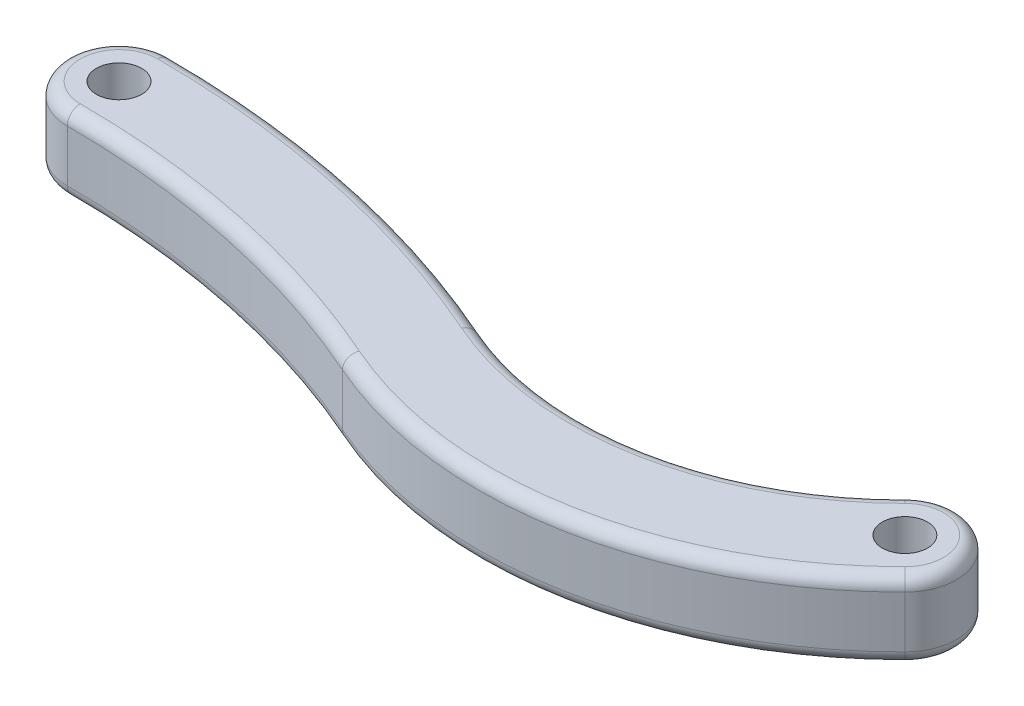
ISO-10303-21;
HEADER;
FILE_DESCRIPTION(('STEP AP214'),'2;1');
FILE_NAME('part.step','',(''),(''),'','','');
FILE_SCHEMA(('AUTOMOTIVE_DESIGN { 1 0 10303 214 1 1 1 1 }'));
ENDSEC;
DATA;
#1=APPLICATION_CONTEXT('core data for automotive mechanical design processes');
#2=APPLICATION_PROTOCOL_DEFINITION('international standard','automotive_design',2000,#1);
#3=PRODUCT_CONTEXT('',#1,'mechanical');
#4=PRODUCT('Part','Part','',(#3));
#5=PRODUCT_RELATED_PRODUCT_CATEGORY('part','',(#4));
#6=PRODUCT_DEFINITION_FORMATION('','',#4);
#7=PRODUCT_DEFINITION_CONTEXT('part definition',#1,'design');
#8=PRODUCT_DEFINITION('design','',#6,#7);
#9=PRODUCT_DEFINITION_SHAPE('','',#8);
#10=(LENGTH_UNIT() NAMED_UNIT(*) SI_UNIT(.MILLI.,.METRE.));
#11=(NAMED_UNIT(*) PLANE_ANGLE_UNIT() SI_UNIT($,.RADIAN.));
#12=(NAMED_UNIT(*) SI_UNIT($,.STERADIAN.) SOLID_ANGLE_UNIT());
#13=UNCERTAINTY_MEASURE_WITH_UNIT(LENGTH_MEASURE(1.E-05),#10,'distance_accuracy_value','');
#14=(GEOMETRIC_REPRESENTATION_CONTEXT(3) GLOBAL_UNCERTAINTY_ASSIGNED_CONTEXT((#13)) GLOBAL_UNIT_ASSIGNED_CONTEXT((#10,
#11,#12)) REPRESENTATION_CONTEXT('',''));
#15=CARTESIAN_POINT('',(0.,0.,0.));
#16=DIRECTION('',(0.,0.,1.));
#17=DIRECTION('',(1.,0.,0.));
#18=AXIS2_PLACEMENT_3D('',#15,#16,#17);
#19=CARTESIAN_POINT('',(-10.253048327205,6.,25.1576044043321));
#20=DIRECTION('',(0.,-1.,0.));
#21=DIRECTION('',(0.,0.,-1.));
#22=AXIS2_PLACEMENT_3D('',#19,#20,#21);
#23=PLANE('',#22);
#24=CARTESIAN_POINT('',(9.89390334559001,6.,-20.5060966544098));
#25=DIRECTION('',(0.,-1.,0.));
#26=DIRECTION('',(0.,0.,-1.));
#27=AXIS2_PLACEMENT_3D('',#24,#25,#26);
#28=CIRCLE('',#27,32.);
#29=CARTESIAN_POINT('',(-3.02322793292108,6.,8.77098857506128));
#30=VERTEX_POINT('',#29);
#31=CARTESIAN_POINT('',(32.5213203435597,6.,2.12132034355962));
#32=VERTEX_POINT('',#31);
#33=EDGE_CURVE('E154',#30,#32,#28,.F.);
#34=ORIENTED_EDGE('',*,*,#33,.T.);
#35=CARTESIAN_POINT('',(30.4,6.,0.));
#36=DIRECTION('',(0.,-1.,0.));
#37=DIRECTION('',(0.,0.,-1.));
#38=AXIS2_PLACEMENT_3D('',#35,#36,#37);
#39=CIRCLE('',#38,3.);
#40=CARTESIAN_POINT('',(28.2786796564403,6.,-2.12132034355963));
#41=VERTEX_POINT('',#40);
#42=EDGE_CURVE('E135',#32,#41,#39,.F.);
#43=ORIENTED_EDGE('',*,*,#42,.T.);
#44=CARTESIAN_POINT('',(9.89390334558999,6.,-20.5060966544098));
#45=DIRECTION('',(0.,-1.,0.));
#46=DIRECTION('',(0.,0.,-1.));
#47=AXIS2_PLACEMENT_3D('',#44,#45,#46);
#48=CIRCLE('',#47,26.);
#49=CARTESIAN_POINT('',(-0.601265818200273,6.,3.28153509453545));
#50=VERTEX_POINT('',#49);
#51=EDGE_CURVE('E143',#41,#50,#48,.T.);
#52=ORIENTED_EDGE('',*,*,#51,.T.);
#53=CARTESIAN_POINT('',(-30.4,6.,70.8213054630739));
#54=DIRECTION('',(0.,-1.,0.));
#55=DIRECTION('',(0.,0.,-1.));
#56=AXIS2_PLACEMENT_3D('',#53,#54,#55);
#57=CIRCLE('',#56,73.8213054630739);
#58=CARTESIAN_POINT('',(-30.4,6.,-3.));
#59=VERTEX_POINT('',#58);
#60=EDGE_CURVE('E149',#50,#59,#57,.F.);
#61=ORIENTED_EDGE('',*,*,#60,.T.);
#62=CARTESIAN_POINT('',(-30.4,6.,0.));
#63=DIRECTION('',(0.,-1.,0.));
#64=DIRECTION('',(0.,0.,-1.));
#65=AXIS2_PLACEMENT_3D('',#62,#63,#64);
#66=CIRCLE('',#65,3.);
#67=CARTESIAN_POINT('',(-30.4,6.,3.));
#68=VERTEX_POINT('',#67);
#69=EDGE_CURVE('E266',#59,#68,#66,.F.);
#70=ORIENTED_EDGE('',*,*,#69,.T.);
#71=CARTESIAN_POINT('',(-30.4,6.,70.8213054630739));
#72=DIRECTION('',(0.,-1.,0.));
#73=DIRECTION('',(0.,0.,-1.));
#74=AXIS2_PLACEMENT_3D('',#71,#72,#73);
#75=CIRCLE('',#74,67.8213054630739);
#76=EDGE_CURVE('E160',#68,#30,#75,.T.);
#77=ORIENTED_EDGE('',*,*,#76,.T.);
#78=EDGE_LOOP('',(#34,#43,#52,#61,#70,#77));
#79=FACE_BOUND('',#78,.T.);
#80=CARTESIAN_POINT('',(-30.4,6.,0.));
#81=DIRECTION('',(0.,1.,0.));
#82=DIRECTION('',(0.,0.,1.));
#83=AXIS2_PLACEMENT_3D('',#80,#81,#82);
#84=CIRCLE('',#83,1.75);
#85=CARTESIAN_POINT('',(-30.4,6.,1.75));
#86=VERTEX_POINT('',#85);
#87=EDGE_CURVE('E254',#86,#86,#84,.T.);
#88=ORIENTED_EDGE('',*,*,#87,.F.);
#89=EDGE_LOOP('',(#88));
#90=FACE_BOUND('',#89,.T.);
#91=CARTESIAN_POINT('',(30.4,6.,0.));
#92=DIRECTION('',(0.,1.,0.));
#93=DIRECTION('',(0.,0.,1.));
#94=AXIS2_PLACEMENT_3D('',#91,#92,#93);
#95=CIRCLE('',#94,1.75);
#96=CARTESIAN_POINT('',(30.4,6.,1.75));
#97=VERTEX_POINT('',#96);
#98=EDGE_CURVE('E472',#97,#97,#95,.T.);
#99=ORIENTED_EDGE('',*,*,#98,.F.);
#100=EDGE_LOOP('',(#99));
#101=FACE_BOUND('',#100,.T.);
#102=ADVANCED_FACE('F38',(#79,#90,#101),#23,.F.);
#103=CARTESIAN_POINT('',(-10.253048327205,0.,25.1576044043321));
#104=DIRECTION('',(0.,-1.,0.));
#105=DIRECTION('',(0.,0.,-1.));
#106=AXIS2_PLACEMENT_3D('',#103,#104,#105);
#107=PLANE('',#106);
#108=CARTESIAN_POINT('',(9.89390334558999,0.,-20.5060966544098));
#109=DIRECTION('',(0.,-1.,0.));
#110=DIRECTION('',(0.,0.,-1.));
#111=AXIS2_PLACEMENT_3D('',#108,#109,#110);
#112=CIRCLE('',#111,26.);
#113=CARTESIAN_POINT('',(-0.601265818200273,0.,3.28153509453545));
#114=VERTEX_POINT('',#113);
#115=CARTESIAN_POINT('',(28.2786796564403,0.,-2.12132034355963));
#116=VERTEX_POINT('',#115);
#117=EDGE_CURVE('E181',#114,#116,#112,.F.);
#118=ORIENTED_EDGE('',*,*,#117,.T.);
#119=CARTESIAN_POINT('',(30.4,0.,0.));
#120=DIRECTION('',(0.,-1.,0.));
#121=DIRECTION('',(0.,0.,-1.));
#122=AXIS2_PLACEMENT_3D('',#119,#120,#121);
#123=CIRCLE('',#122,3.);
#124=CARTESIAN_POINT('',(32.5213203435597,0.,2.12132034355962));
#125=VERTEX_POINT('',#124);
#126=EDGE_CURVE('E190',#116,#125,#123,.T.);
#127=ORIENTED_EDGE('',*,*,#126,.T.);
#128=CARTESIAN_POINT('',(9.89390334559001,0.,-20.5060966544098));
#129=DIRECTION('',(0.,-1.,0.));
#130=DIRECTION('',(0.,0.,-1.));
#131=AXIS2_PLACEMENT_3D('',#128,#129,#130);
#132=CIRCLE('',#131,32.);
#133=CARTESIAN_POINT('',(-3.02322793292108,0.,8.77098857506128));
#134=VERTEX_POINT('',#133);
#135=EDGE_CURVE('E62',#125,#134,#132,.T.);
#136=ORIENTED_EDGE('',*,*,#135,.T.);
#137=CARTESIAN_POINT('',(-30.4,0.,70.8213054630739));
#138=DIRECTION('',(0.,-1.,0.));
#139=DIRECTION('',(0.,0.,-1.));
#140=AXIS2_PLACEMENT_3D('',#137,#138,#139);
#141=CIRCLE('',#140,67.8213054630739);
#142=CARTESIAN_POINT('',(-30.4,0.,3.));
#143=VERTEX_POINT('',#142);
#144=EDGE_CURVE('E187',#134,#143,#141,.F.);
#145=ORIENTED_EDGE('',*,*,#144,.T.);
#146=CARTESIAN_POINT('',(-30.4,0.,0.));
#147=DIRECTION('',(0.,-1.,0.));
#148=DIRECTION('',(0.,0.,-1.));
#149=AXIS2_PLACEMENT_3D('',#146,#147,#148);
#150=CIRCLE('',#149,3.);
#151=CARTESIAN_POINT('',(-30.4,0.,-3.));
#152=VERTEX_POINT('',#151);
#153=EDGE_CURVE('E185',#143,#152,#150,.T.);
#154=ORIENTED_EDGE('',*,*,#153,.T.);
#155=CARTESIAN_POINT('',(-30.4,0.,70.8213054630739));
#156=DIRECTION('',(0.,-1.,0.));
#157=DIRECTION('',(0.,0.,-1.));
#158=AXIS2_PLACEMENT_3D('',#155,#156,#157);
#159=CIRCLE('',#158,73.8213054630739);
#160=EDGE_CURVE('E183',#152,#114,#159,.T.);
#161=ORIENTED_EDGE('',*,*,#160,.T.);
#162=EDGE_LOOP('',(#118,#127,#136,#145,#154,#161));
#163=FACE_BOUND('',#162,.T.);
#164=CARTESIAN_POINT('',(-30.4,0.,0.));
#165=DIRECTION('',(0.,1.,0.));
#166=DIRECTION('',(0.,0.,1.));
#167=AXIS2_PLACEMENT_3D('',#164,#165,#166);
#168=CIRCLE('',#167,1.75);
#169=CARTESIAN_POINT('',(-30.4,0.,1.75));
#170=VERTEX_POINT('',#169);
#171=EDGE_CURVE('E477',#170,#170,#168,.T.);
#172=ORIENTED_EDGE('',*,*,#171,.T.);
#173=EDGE_LOOP('',(#172));
#174=FACE_BOUND('',#173,.T.);
#175=CARTESIAN_POINT('',(30.4,0.,0.));
#176=DIRECTION('',(0.,1.,0.));
#177=DIRECTION('',(0.,0.,1.));
#178=AXIS2_PLACEMENT_3D('',#175,#176,#177);
#179=CIRCLE('',#178,1.75);
#180=CARTESIAN_POINT('',(30.4,0.,1.75));
#181=VERTEX_POINT('',#180);
#182=EDGE_CURVE('E204',#181,#181,#179,.T.);
#183=ORIENTED_EDGE('',*,*,#182,.T.);
#184=EDGE_LOOP('',(#183));
#185=FACE_BOUND('',#184,.T.);
#186=ADVANCED_FACE('F228',(#163,#174,#185),#107,.T.);
#187=CARTESIAN_POINT('',(-30.4,6.,70.8213054630739));
#188=DIRECTION('',(0.,-1.,0.));
#189=DIRECTION('',(0.,0.,-1.));
#190=AXIS2_PLACEMENT_3D('',#187,#188,#189);
#191=CYLINDRICAL_SURFACE('',#190,74.8213054630739);
#192=DIRECTION('',(0.,-1.,0.));
#193=VECTOR('',#192,1.);
#194=CARTESIAN_POINT('',(-30.4,6.,-4.));
#195=LINE('',#194,#193);
#196=CARTESIAN_POINT('',(-30.4,5.,-4.));
#197=VERTEX_POINT('',#196);
#198=CARTESIAN_POINT('',(-30.4,1.,-4.));
#199=VERTEX_POINT('',#198);
#200=EDGE_CURVE('E150',#197,#199,#195,.T.);
#201=ORIENTED_EDGE('',*,*,#200,.F.);
#202=CARTESIAN_POINT('',(-30.4,5.,70.8213054630739));
#203=DIRECTION('',(0.,-1.,0.));
#204=DIRECTION('',(0.,0.,-1.));
#205=AXIS2_PLACEMENT_3D('',#202,#203,#204);
#206=CIRCLE('',#205,74.8213054630739);
#207=CARTESIAN_POINT('',(-0.197605465746802,5.,2.36662618111448));
#208=VERTEX_POINT('',#207);
#209=EDGE_CURVE('E179',#197,#208,#206,.T.);
#210=ORIENTED_EDGE('',*,*,#209,.T.);
#211=DIRECTION('',(0.,-1.,0.));
#212=VECTOR('',#211,1.);
#213=CARTESIAN_POINT('',(-0.197605465746802,6.,2.36662618111448));
#214=LINE('',#213,#212);
#215=CARTESIAN_POINT('',(-0.197605465746802,1.,2.36662618111448));
#216=VERTEX_POINT('',#215);
#217=EDGE_CURVE('E250',#208,#216,#214,.T.);
#218=ORIENTED_EDGE('',*,*,#217,.T.);
#219=CARTESIAN_POINT('',(-30.4,1.,70.8213054630739));
#220=DIRECTION('',(0.,-1.,0.));
#221=DIRECTION('',(0.,0.,-1.));
#222=AXIS2_PLACEMENT_3D('',#219,#220,#221);
#223=CIRCLE('',#222,74.8213054630739);
#224=EDGE_CURVE('E177',#216,#199,#223,.F.);
#225=ORIENTED_EDGE('',*,*,#224,.T.);
#226=EDGE_LOOP('',(#201,#210,#218,#225));
#227=FACE_BOUND('',#226,.T.);
#228=ADVANCED_FACE('F297',(#227),#191,.T.);
#229=CARTESIAN_POINT('',(-30.4,6.,0.));
#230=DIRECTION('',(0.,-1.,0.));
#231=DIRECTION('',(0.,0.,-1.));
#232=AXIS2_PLACEMENT_3D('',#229,#230,#231);
#233=CYLINDRICAL_SURFACE('',#232,4.);
#234=DIRECTION('',(0.,-1.,0.));
#235=VECTOR('',#234,1.);
#236=CARTESIAN_POINT('',(-30.4,6.,4.));
#237=LINE('',#236,#235);
#238=CARTESIAN_POINT('',(-30.4,5.,4.));
#239=VERTEX_POINT('',#238);
#240=CARTESIAN_POINT('',(-30.4,1.,4.));
#241=VERTEX_POINT('',#240);
#242=EDGE_CURVE('E260',#239,#241,#237,.T.);
#243=ORIENTED_EDGE('',*,*,#242,.F.);
#244=CARTESIAN_POINT('',(-30.4,5.,0.));
#245=DIRECTION('',(0.,-1.,0.));
#246=DIRECTION('',(0.,0.,-1.));
#247=AXIS2_PLACEMENT_3D('',#244,#245,#246);
#248=CIRCLE('',#247,4.);
#249=EDGE_CURVE('E175',#239,#197,#248,.T.);
#250=ORIENTED_EDGE('',*,*,#249,.T.);
#251=ORIENTED_EDGE('',*,*,#200,.T.);
#252=CARTESIAN_POINT('',(-30.4,1.,0.));
#253=DIRECTION('',(0.,-1.,0.));
#254=DIRECTION('',(0.,0.,-1.));
#255=AXIS2_PLACEMENT_3D('',#252,#253,#254);
#256=CIRCLE('',#255,4.);
#257=EDGE_CURVE('E173',#199,#241,#256,.F.);
#258=ORIENTED_EDGE('',*,*,#257,.T.);
#259=EDGE_LOOP('',(#243,#250,#251,#258));
#260=FACE_BOUND('',#259,.T.);
#261=ADVANCED_FACE('F312',(#260),#233,.T.);
#262=CARTESIAN_POINT('',(-30.4,6.,70.8213054630739));
#263=DIRECTION('',(0.,-1.,0.));
#264=DIRECTION('',(0.,0.,-1.));
#265=AXIS2_PLACEMENT_3D('',#262,#263,#264);
#266=CYLINDRICAL_SURFACE('',#265,66.8213054630739);
#267=DIRECTION('',(0.,-1.,0.));
#268=VECTOR('',#267,1.);
#269=CARTESIAN_POINT('',(-3.42688828537455,6.,9.68589748848225));
#270=LINE('',#269,#268);
#271=CARTESIAN_POINT('',(-3.42688828537455,5.,9.68589748848225));
#272=VERTEX_POINT('',#271);
#273=CARTESIAN_POINT('',(-3.42688828537455,1.,9.68589748848225));
#274=VERTEX_POINT('',#273);
#275=EDGE_CURVE('E252',#272,#274,#270,.T.);
#276=ORIENTED_EDGE('',*,*,#275,.F.);
#277=CARTESIAN_POINT('',(-30.4,5.,70.8213054630739));
#278=DIRECTION('',(0.,-1.,0.));
#279=DIRECTION('',(0.,0.,-1.));
#280=AXIS2_PLACEMENT_3D('',#277,#278,#279);
#281=CIRCLE('',#280,66.8213054630739);
#282=EDGE_CURVE('E171',#272,#239,#281,.F.);
#283=ORIENTED_EDGE('',*,*,#282,.T.);
#284=ORIENTED_EDGE('',*,*,#242,.T.);
#285=CARTESIAN_POINT('',(-30.4,1.,70.8213054630739));
#286=DIRECTION('',(0.,-1.,0.));
#287=DIRECTION('',(0.,0.,-1.));
#288=AXIS2_PLACEMENT_3D('',#285,#286,#287);
#289=CIRCLE('',#288,66.8213054630739);
#290=EDGE_CURVE('E169',#241,#274,#289,.T.);
#291=ORIENTED_EDGE('',*,*,#290,.T.);
#292=EDGE_LOOP('',(#276,#283,#284,#291));
#293=FACE_BOUND('',#292,.T.);
#294=ADVANCED_FACE('F309',(#293),#266,.F.);
#295=CARTESIAN_POINT('',(9.89390334559001,6.,-20.5060966544098));
#296=DIRECTION('',(0.,-1.,0.));
#297=DIRECTION('',(0.,0.,-1.));
#298=AXIS2_PLACEMENT_3D('',#295,#296,#297);
#299=CYLINDRICAL_SURFACE('',#298,33.);
#300=DIRECTION('',(0.,-1.,0.));
#301=VECTOR('',#300,1.);
#302=CARTESIAN_POINT('',(33.2284271247462,6.,2.82842712474616));
#303=LINE('',#302,#301);
#304=CARTESIAN_POINT('',(33.2284271247462,5.,2.82842712474616));
#305=VERTEX_POINT('',#304);
#306=CARTESIAN_POINT('',(33.2284271247462,1.,2.82842712474616));
#307=VERTEX_POINT('',#306);
#308=EDGE_CURVE('E245',#305,#307,#303,.T.);
#309=ORIENTED_EDGE('',*,*,#308,.F.);
#310=CARTESIAN_POINT('',(9.89390334559001,5.,-20.5060966544098));
#311=DIRECTION('',(0.,-1.,0.));
#312=DIRECTION('',(0.,0.,-1.));
#313=AXIS2_PLACEMENT_3D('',#310,#311,#312);
#314=CIRCLE('',#313,33.);
#315=EDGE_CURVE('E167',#305,#272,#314,.T.);
#316=ORIENTED_EDGE('',*,*,#315,.T.);
#317=ORIENTED_EDGE('',*,*,#275,.T.);
#318=CARTESIAN_POINT('',(9.89390334559001,1.,-20.5060966544098));
#319=DIRECTION('',(0.,-1.,0.));
#320=DIRECTION('',(0.,0.,-1.));
#321=AXIS2_PLACEMENT_3D('',#318,#319,#320);
#322=CIRCLE('',#321,33.);
#323=EDGE_CURVE('E165',#274,#307,#322,.F.);
#324=ORIENTED_EDGE('',*,*,#323,.T.);
#325=EDGE_LOOP('',(#309,#316,#317,#324));
#326=FACE_BOUND('',#325,.T.);
#327=ADVANCED_FACE('F279',(#326),#299,.T.);
#328=CARTESIAN_POINT('',(30.4,6.,0.));
#329=DIRECTION('',(0.,-1.,0.));
#330=DIRECTION('',(0.,0.,-1.));
#331=AXIS2_PLACEMENT_3D('',#328,#329,#330);
#332=CYLINDRICAL_SURFACE('',#331,4.);
#333=DIRECTION('',(0.,-1.,0.));
#334=VECTOR('',#333,1.);
#335=CARTESIAN_POINT('',(27.5715728752538,6.,-2.82842712474617));
#336=LINE('',#335,#334);
#337=CARTESIAN_POINT('',(27.5715728752538,5.,-2.82842712474617));
#338=VERTEX_POINT('',#337);
#339=CARTESIAN_POINT('',(27.5715728752538,1.,-2.82842712474617));
#340=VERTEX_POINT('',#339);
#341=EDGE_CURVE('E243',#338,#340,#336,.T.);
#342=ORIENTED_EDGE('',*,*,#341,.F.);
#343=CARTESIAN_POINT('',(30.4,5.,0.));
#344=DIRECTION('',(0.,-1.,0.));
#345=DIRECTION('',(0.,0.,-1.));
#346=AXIS2_PLACEMENT_3D('',#343,#344,#345);
#347=CIRCLE('',#346,4.);
#348=EDGE_CURVE('E137',#338,#305,#347,.T.);
#349=ORIENTED_EDGE('',*,*,#348,.T.);
#350=ORIENTED_EDGE('',*,*,#308,.T.);
#351=CARTESIAN_POINT('',(30.4,1.,0.));
#352=DIRECTION('',(0.,-1.,0.));
#353=DIRECTION('',(0.,0.,-1.));
#354=AXIS2_PLACEMENT_3D('',#351,#352,#353);
#355=CIRCLE('',#354,4.);
#356=EDGE_CURVE('E156',#307,#340,#355,.F.);
#357=ORIENTED_EDGE('',*,*,#356,.T.);
#358=EDGE_LOOP('',(#342,#349,#350,#357));
#359=FACE_BOUND('',#358,.T.);
#360=ADVANCED_FACE('F242',(#359),#332,.T.);
#361=CARTESIAN_POINT('',(9.89390334558999,6.,-20.5060966544098));
#362=DIRECTION('',(0.,-1.,0.));
#363=DIRECTION('',(0.,0.,-1.));
#364=AXIS2_PLACEMENT_3D('',#361,#362,#363);
#365=CYLINDRICAL_SURFACE('',#364,25.);
#366=ORIENTED_EDGE('',*,*,#217,.F.);
#367=CARTESIAN_POINT('',(9.89390334558999,5.,-20.5060966544098));
#368=DIRECTION('',(0.,-1.,0.));
#369=DIRECTION('',(0.,0.,-1.));
#370=AXIS2_PLACEMENT_3D('',#367,#368,#369);
#371=CIRCLE('',#370,25.);
#372=EDGE_CURVE('E11',#208,#338,#371,.F.);
#373=ORIENTED_EDGE('',*,*,#372,.T.);
#374=ORIENTED_EDGE('',*,*,#341,.T.);
#375=CARTESIAN_POINT('',(9.89390334558999,1.,-20.5060966544098));
#376=DIRECTION('',(0.,-1.,0.));
#377=DIRECTION('',(0.,0.,-1.));
#378=AXIS2_PLACEMENT_3D('',#375,#376,#377);
#379=CIRCLE('',#378,25.);
#380=EDGE_CURVE('E47',#340,#216,#379,.T.);
#381=ORIENTED_EDGE('',*,*,#380,.T.);
#382=EDGE_LOOP('',(#366,#373,#374,#381));
#383=FACE_BOUND('',#382,.T.);
#384=ADVANCED_FACE('F248',(#383),#365,.F.);
#385=CARTESIAN_POINT('',(-30.4,6.,0.));
#386=DIRECTION('',(0.,-1.,0.));
#387=DIRECTION('',(0.,0.,-1.));
#388=AXIS2_PLACEMENT_3D('',#385,#386,#387);
#389=CYLINDRICAL_SURFACE('',#388,1.75);
#390=ORIENTED_EDGE('',*,*,#87,.T.);
#391=EDGE_LOOP('',(#390));
#392=FACE_BOUND('',#391,.T.);
#393=ORIENTED_EDGE('',*,*,#171,.F.);
#394=EDGE_LOOP('',(#393));
#395=FACE_BOUND('',#394,.T.);
#396=ADVANCED_FACE('F300',(#392,#395),#389,.F.);
#397=CARTESIAN_POINT('',(30.4,6.,0.));
#398=DIRECTION('',(0.,-1.,0.));
#399=DIRECTION('',(0.,0.,-1.));
#400=AXIS2_PLACEMENT_3D('',#397,#398,#399);
#401=CYLINDRICAL_SURFACE('',#400,1.75);
#402=ORIENTED_EDGE('',*,*,#98,.T.);
#403=EDGE_LOOP('',(#402));
#404=FACE_BOUND('',#403,.T.);
#405=ORIENTED_EDGE('',*,*,#182,.F.);
#406=EDGE_LOOP('',(#405));
#407=FACE_BOUND('',#406,.T.);
#408=ADVANCED_FACE('F335',(#404,#407),#401,.F.);
#409=CARTESIAN_POINT('',(-30.4,5.,0.));
#410=DIRECTION('',(0.,-1.,0.));
#411=DIRECTION('',(0.,0.,-1.));
#412=AXIS2_PLACEMENT_3D('',#409,#410,#411);
#413=TOROIDAL_SURFACE('',#412,3.,1.);
#414=CARTESIAN_POINT('',(-30.4,5.,-3.));
#415=DIRECTION('',(1.,0.,0.));
#416=DIRECTION('',(0.,0.,-1.));
#417=AXIS2_PLACEMENT_3D('',#414,#415,#416);
#418=CIRCLE('',#417,1.);
#419=EDGE_CURVE('E198',#197,#59,#418,.T.);
#420=ORIENTED_EDGE('',*,*,#419,.F.);
#421=ORIENTED_EDGE('',*,*,#249,.F.);
#422=CARTESIAN_POINT('',(-30.4,5.,3.));
#423=DIRECTION('',(1.,0.,0.));
#424=DIRECTION('',(0.,0.,-1.));
#425=AXIS2_PLACEMENT_3D('',#422,#423,#424);
#426=CIRCLE('',#425,1.);
#427=EDGE_CURVE('E201',#68,#239,#426,.T.);
#428=ORIENTED_EDGE('',*,*,#427,.F.);
#429=ORIENTED_EDGE('',*,*,#69,.F.);
#430=EDGE_LOOP('',(#420,#421,#428,#429));
#431=FACE_BOUND('',#430,.T.);
#432=ADVANCED_FACE('F332',(#431),#413,.T.);
#433=CARTESIAN_POINT('',(-30.4,5.,70.8213054630739));
#434=DIRECTION('',(0.,-1.,0.));
#435=DIRECTION('',(0.,0.,-1.));
#436=AXIS2_PLACEMENT_3D('',#433,#434,#435);
#437=TOROIDAL_SURFACE('',#436,67.8213054630739,1.);
#438=ORIENTED_EDGE('',*,*,#427,.T.);
#439=ORIENTED_EDGE('',*,*,#282,.F.);
#440=CARTESIAN_POINT('',(-3.02322793292108,5.,8.77098857506128));
#441=DIRECTION('',(0.91490891342097,0.,0.403660352453471));
#442=DIRECTION('',(0.403660352453471,0.,-0.91490891342097));
#443=AXIS2_PLACEMENT_3D('',#440,#441,#442);
#444=CIRCLE('',#443,1.);
#445=EDGE_CURVE('E195',#30,#272,#444,.T.);
#446=ORIENTED_EDGE('',*,*,#445,.F.);
#447=ORIENTED_EDGE('',*,*,#76,.F.);
#448=EDGE_LOOP('',(#438,#439,#446,#447));
#449=FACE_BOUND('',#448,.T.);
#450=ADVANCED_FACE('F273',(#449),#437,.T.);
#451=CARTESIAN_POINT('',(-30.4,5.,70.8213054630739));
#452=DIRECTION('',(0.,-1.,0.));
#453=DIRECTION('',(0.,0.,-1.));
#454=AXIS2_PLACEMENT_3D('',#451,#452,#453);
#455=TOROIDAL_SURFACE('',#454,73.8213054630739,1.);
#456=ORIENTED_EDGE('',*,*,#419,.T.);
#457=ORIENTED_EDGE('',*,*,#60,.F.);
#458=CARTESIAN_POINT('',(-0.601265818200267,5.,3.28153509453544));
#459=DIRECTION('',(0.91490891342097,0.,0.403660352453471));
#460=DIRECTION('',(0.403660352453471,0.,-0.91490891342097));
#461=AXIS2_PLACEMENT_3D('',#458,#459,#460);
#462=CIRCLE('',#461,1.);
#463=EDGE_CURVE('E146',#208,#50,#462,.T.);
#464=ORIENTED_EDGE('',*,*,#463,.F.);
#465=ORIENTED_EDGE('',*,*,#209,.F.);
#466=EDGE_LOOP('',(#456,#457,#464,#465));
#467=FACE_BOUND('',#466,.T.);
#468=ADVANCED_FACE('F326',(#467),#455,.T.);
#469=CARTESIAN_POINT('',(9.89390334559001,5.,-20.5060966544098));
#470=DIRECTION('',(0.,-1.,0.));
#471=DIRECTION('',(0.,0.,-1.));
#472=AXIS2_PLACEMENT_3D('',#469,#470,#471);
#473=TOROIDAL_SURFACE('',#472,32.,1.);
#474=ORIENTED_EDGE('',*,*,#445,.T.);
#475=ORIENTED_EDGE('',*,*,#315,.F.);
#476=CARTESIAN_POINT('',(32.5213203435597,5.,2.12132034355962));
#477=DIRECTION('',(0.707106781186543,0.,-0.707106781186552));
#478=DIRECTION('',(-0.707106781186552,0.,-0.707106781186543));
#479=AXIS2_PLACEMENT_3D('',#476,#477,#478);
#480=CIRCLE('',#479,1.);
#481=EDGE_CURVE('E140',#32,#305,#480,.T.);
#482=ORIENTED_EDGE('',*,*,#481,.F.);
#483=ORIENTED_EDGE('',*,*,#33,.F.);
#484=EDGE_LOOP('',(#474,#475,#482,#483));
#485=FACE_BOUND('',#484,.T.);
#486=ADVANCED_FACE('F276',(#485),#473,.T.);
#487=CARTESIAN_POINT('',(9.89390334558999,5.,-20.5060966544098));
#488=DIRECTION('',(0.,-1.,0.));
#489=DIRECTION('',(0.,0.,-1.));
#490=AXIS2_PLACEMENT_3D('',#487,#488,#489);
#491=TOROIDAL_SURFACE('',#490,26.,1.);
#492=ORIENTED_EDGE('',*,*,#463,.T.);
#493=ORIENTED_EDGE('',*,*,#51,.F.);
#494=CARTESIAN_POINT('',(28.2786796564403,5.,-2.12132034355964));
#495=DIRECTION('',(0.707106781186543,0.,-0.707106781186552));
#496=DIRECTION('',(-0.707106781186552,0.,-0.707106781186543));
#497=AXIS2_PLACEMENT_3D('',#494,#495,#496);
#498=CIRCLE('',#497,1.);
#499=EDGE_CURVE('E131',#338,#41,#498,.T.);
#500=ORIENTED_EDGE('',*,*,#499,.F.);
#501=ORIENTED_EDGE('',*,*,#372,.F.);
#502=EDGE_LOOP('',(#492,#493,#500,#501));
#503=FACE_BOUND('',#502,.T.);
#504=ADVANCED_FACE('F144',(#503),#491,.T.);
#505=CARTESIAN_POINT('',(30.4,5.,0.));
#506=DIRECTION('',(0.,-1.,0.));
#507=DIRECTION('',(0.,0.,-1.));
#508=AXIS2_PLACEMENT_3D('',#505,#506,#507);
#509=TOROIDAL_SURFACE('',#508,3.,1.);
#510=ORIENTED_EDGE('',*,*,#481,.T.);
#511=ORIENTED_EDGE('',*,*,#348,.F.);
#512=ORIENTED_EDGE('',*,*,#499,.T.);
#513=ORIENTED_EDGE('',*,*,#42,.F.);
#514=EDGE_LOOP('',(#510,#511,#512,#513));
#515=FACE_BOUND('',#514,.T.);
#516=ADVANCED_FACE('F133',(#515),#509,.T.);
#517=CARTESIAN_POINT('',(-30.4,1.,0.));
#518=DIRECTION('',(0.,-1.,0.));
#519=DIRECTION('',(0.,0.,-1.));
#520=AXIS2_PLACEMENT_3D('',#517,#518,#519);
#521=TOROIDAL_SURFACE('',#520,3.,1.);
#522=CARTESIAN_POINT('',(-30.4,1.,-3.));
#523=DIRECTION('',(1.,0.,0.));
#524=DIRECTION('',(0.,0.,-1.));
#525=AXIS2_PLACEMENT_3D('',#522,#523,#524);
#526=CIRCLE('',#525,1.);
#527=EDGE_CURVE('E213',#152,#199,#526,.T.);
#528=ORIENTED_EDGE('',*,*,#527,.F.);
#529=ORIENTED_EDGE('',*,*,#153,.F.);
#530=CARTESIAN_POINT('',(-30.4,1.,3.));
#531=DIRECTION('',(1.,0.,0.));
#532=DIRECTION('',(0.,0.,-1.));
#533=AXIS2_PLACEMENT_3D('',#530,#531,#532);
#534=CIRCLE('',#533,1.);
#535=EDGE_CURVE('E42',#241,#143,#534,.T.);
#536=ORIENTED_EDGE('',*,*,#535,.F.);
#537=ORIENTED_EDGE('',*,*,#257,.F.);
#538=EDGE_LOOP('',(#528,#529,#536,#537));
#539=FACE_BOUND('',#538,.T.);
#540=ADVANCED_FACE('F40',(#539),#521,.T.);
#541=CARTESIAN_POINT('',(-30.4,1.,70.8213054630739));
#542=DIRECTION('',(0.,-1.,0.));
#543=DIRECTION('',(0.,0.,-1.));
#544=AXIS2_PLACEMENT_3D('',#541,#542,#543);
#545=TOROIDAL_SURFACE('',#544,67.8213054630739,1.);
#546=ORIENTED_EDGE('',*,*,#535,.T.);
#547=ORIENTED_EDGE('',*,*,#144,.F.);
#548=CARTESIAN_POINT('',(-3.02322793292108,1.,8.77098857506128));
#549=DIRECTION('',(0.91490891342097,0.,0.403660352453471));
#550=DIRECTION('',(0.403660352453471,0.,-0.91490891342097));
#551=AXIS2_PLACEMENT_3D('',#548,#549,#550);
#552=CIRCLE('',#551,1.);
#553=EDGE_CURVE('E211',#274,#134,#552,.T.);
#554=ORIENTED_EDGE('',*,*,#553,.F.);
#555=ORIENTED_EDGE('',*,*,#290,.F.);
#556=EDGE_LOOP('',(#546,#547,#554,#555));
#557=FACE_BOUND('',#556,.T.);
#558=ADVANCED_FACE('F223',(#557),#545,.T.);
#559=CARTESIAN_POINT('',(-30.4,1.,70.8213054630739));
#560=DIRECTION('',(0.,-1.,0.));
#561=DIRECTION('',(0.,0.,-1.));
#562=AXIS2_PLACEMENT_3D('',#559,#560,#561);
#563=TOROIDAL_SURFACE('',#562,73.8213054630739,1.);
#564=ORIENTED_EDGE('',*,*,#527,.T.);
#565=ORIENTED_EDGE('',*,*,#224,.F.);
#566=CARTESIAN_POINT('',(-0.601265818200267,1.,3.28153509453544));
#567=DIRECTION('',(0.91490891342097,0.,0.403660352453471));
#568=DIRECTION('',(0.403660352453471,0.,-0.91490891342097));
#569=AXIS2_PLACEMENT_3D('',#566,#567,#568);
#570=CIRCLE('',#569,1.);
#571=EDGE_CURVE('E208',#114,#216,#570,.T.);
#572=ORIENTED_EDGE('',*,*,#571,.F.);
#573=ORIENTED_EDGE('',*,*,#160,.F.);
#574=EDGE_LOOP('',(#564,#565,#572,#573));
#575=FACE_BOUND('',#574,.T.);
#576=ADVANCED_FACE('F232',(#575),#563,.T.);
#577=CARTESIAN_POINT('',(9.89390334559001,1.,-20.5060966544098));
#578=DIRECTION('',(0.,-1.,0.));
#579=DIRECTION('',(0.,0.,-1.));
#580=AXIS2_PLACEMENT_3D('',#577,#578,#579);
#581=TOROIDAL_SURFACE('',#580,32.,1.);
#582=ORIENTED_EDGE('',*,*,#553,.T.);
#583=ORIENTED_EDGE('',*,*,#135,.F.);
#584=CARTESIAN_POINT('',(32.5213203435597,1.,2.12132034355962));
#585=DIRECTION('',(0.707106781186543,0.,-0.707106781186552));
#586=DIRECTION('',(-0.707106781186552,0.,-0.707106781186543));
#587=AXIS2_PLACEMENT_3D('',#584,#585,#586);
#588=CIRCLE('',#587,1.);
#589=EDGE_CURVE('E55',#307,#125,#588,.T.);
#590=ORIENTED_EDGE('',*,*,#589,.F.);
#591=ORIENTED_EDGE('',*,*,#323,.F.);
#592=EDGE_LOOP('',(#582,#583,#590,#591));
#593=FACE_BOUND('',#592,.T.);
#594=ADVANCED_FACE('F282',(#593),#581,.T.);
#595=CARTESIAN_POINT('',(9.89390334558999,1.,-20.5060966544098));
#596=DIRECTION('',(0.,-1.,0.));
#597=DIRECTION('',(0.,0.,-1.));
#598=AXIS2_PLACEMENT_3D('',#595,#596,#597);
#599=TOROIDAL_SURFACE('',#598,26.,1.);
#600=ORIENTED_EDGE('',*,*,#571,.T.);
#601=ORIENTED_EDGE('',*,*,#380,.F.);
#602=CARTESIAN_POINT('',(28.2786796564403,1.,-2.12132034355963));
#603=DIRECTION('',(0.707106781186545,0.,-0.70710678118655));
#604=DIRECTION('',(-0.70710678118655,0.,-0.707106781186545));
#605=AXIS2_PLACEMENT_3D('',#602,#603,#604);
#606=CIRCLE('',#605,1.);
#607=EDGE_CURVE('E205',#116,#340,#606,.T.);
#608=ORIENTED_EDGE('',*,*,#607,.F.);
#609=ORIENTED_EDGE('',*,*,#117,.F.);
#610=EDGE_LOOP('',(#600,#601,#608,#609));
#611=FACE_BOUND('',#610,.T.);
#612=ADVANCED_FACE('F236',(#611),#599,.T.);
#613=CARTESIAN_POINT('',(30.4,1.,0.));
#614=DIRECTION('',(0.,-1.,0.));
#615=DIRECTION('',(0.,0.,-1.));
#616=AXIS2_PLACEMENT_3D('',#613,#614,#615);
#617=TOROIDAL_SURFACE('',#616,3.,1.);
#618=ORIENTED_EDGE('',*,*,#589,.T.);
#619=ORIENTED_EDGE('',*,*,#126,.F.);
#620=ORIENTED_EDGE('',*,*,#607,.T.);
#621=ORIENTED_EDGE('',*,*,#356,.F.);
#622=EDGE_LOOP('',(#618,#619,#620,#621));
#623=FACE_BOUND('',#622,.T.);
#624=ADVANCED_FACE('F237',(#623),#617,.T.);
#625=CLOSED_SHELL('',(#102,#186,#228,#261,#294,#327,#360,#384,#396,#408,#432,#450,#468,#486,
#504,#516,#540,#558,#576,#594,#612,#624));
#626=MANIFOLD_SOLID_BREP('B2',#625);
#627=ADVANCED_BREP_SHAPE_REPRESENTATION('',(#18,#626),#14);
#628=SHAPE_DEFINITION_REPRESENTATION(#9,#627);
ENDSEC;
END-ISO-10303-21;
